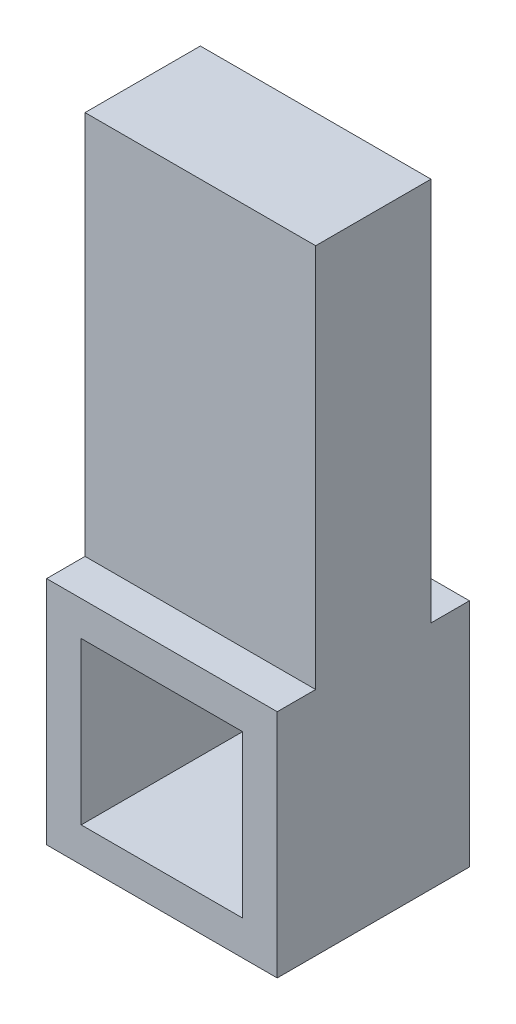
ISO-10303-21;
HEADER;
FILE_DESCRIPTION(('STEP AP214'),'2;1');
FILE_NAME('part.step','',(''),(''),'','','');
FILE_SCHEMA(('AUTOMOTIVE_DESIGN { 1 0 10303 214 1 1 1 1 }'));
ENDSEC;
DATA;
#1=APPLICATION_CONTEXT('core data for automotive mechanical design processes');
#2=APPLICATION_PROTOCOL_DEFINITION('international standard','automotive_design',2000,#1);
#3=PRODUCT_CONTEXT('',#1,'mechanical');
#4=PRODUCT('Part','Part','',(#3));
#5=PRODUCT_RELATED_PRODUCT_CATEGORY('part','',(#4));
#6=PRODUCT_DEFINITION_FORMATION('','',#4);
#7=PRODUCT_DEFINITION_CONTEXT('part definition',#1,'design');
#8=PRODUCT_DEFINITION('design','',#6,#7);
#9=PRODUCT_DEFINITION_SHAPE('','',#8);
#10=(LENGTH_UNIT() NAMED_UNIT(*) SI_UNIT(.MILLI.,.METRE.));
#11=(NAMED_UNIT(*) PLANE_ANGLE_UNIT() SI_UNIT($,.RADIAN.));
#12=(NAMED_UNIT(*) SI_UNIT($,.STERADIAN.) SOLID_ANGLE_UNIT());
#13=UNCERTAINTY_MEASURE_WITH_UNIT(LENGTH_MEASURE(1.E-05),#10,'distance_accuracy_value','');
#14=(GEOMETRIC_REPRESENTATION_CONTEXT(3) GLOBAL_UNCERTAINTY_ASSIGNED_CONTEXT((#13)) GLOBAL_UNIT_ASSIGNED_CONTEXT((#10,
#11,#12)) REPRESENTATION_CONTEXT('',''));
#15=CARTESIAN_POINT('',(0.,0.,0.));
#16=DIRECTION('',(0.,0.,1.));
#17=DIRECTION('',(1.,0.,0.));
#18=AXIS2_PLACEMENT_3D('',#15,#16,#17);
#19=CARTESIAN_POINT('',(3.,3.,2.5));
#20=DIRECTION('',(0.,-1.,0.));
#21=DIRECTION('',(1.,0.,0.));
#22=AXIS2_PLACEMENT_3D('',#19,#20,#21);
#23=PLANE('',#22);
#24=DIRECTION('',(1.,0.,0.));
#25=VECTOR('',#24,1.);
#26=CARTESIAN_POINT('',(-3.,3.,1.5));
#27=LINE('',#26,#25);
#28=CARTESIAN_POINT('',(-3.,3.,1.5));
#29=VERTEX_POINT('',#28);
#30=CARTESIAN_POINT('',(3.,3.,1.5));
#31=VERTEX_POINT('',#30);
#32=EDGE_CURVE('E142',#29,#31,#27,.T.);
#33=ORIENTED_EDGE('',*,*,#32,.F.);
#34=DIRECTION('',(0.,0.,-1.));
#35=VECTOR('',#34,1.);
#36=CARTESIAN_POINT('',(-3.,3.,2.5));
#37=LINE('',#36,#35);
#38=CARTESIAN_POINT('',(-3.,3.,2.5));
#39=VERTEX_POINT('',#38);
#40=EDGE_CURVE('E203',#39,#29,#37,.T.);
#41=ORIENTED_EDGE('',*,*,#40,.F.);
#42=DIRECTION('',(-1.,0.,0.));
#43=VECTOR('',#42,1.);
#44=CARTESIAN_POINT('',(3.,3.,2.5));
#45=LINE('',#44,#43);
#46=CARTESIAN_POINT('',(3.,3.,2.5));
#47=VERTEX_POINT('',#46);
#48=EDGE_CURVE('E194',#47,#39,#45,.T.);
#49=ORIENTED_EDGE('',*,*,#48,.F.);
#50=DIRECTION('',(0.,0.,-1.));
#51=VECTOR('',#50,1.);
#52=CARTESIAN_POINT('',(3.,3.,2.5));
#53=LINE('',#52,#51);
#54=EDGE_CURVE('E207',#47,#31,#53,.T.);
#55=ORIENTED_EDGE('',*,*,#54,.T.);
#56=EDGE_LOOP('',(#33,#41,#49,#55));
#57=FACE_BOUND('',#56,.T.);
#58=ADVANCED_FACE('F37',(#57),#23,.F.);
#59=CARTESIAN_POINT('',(0.,0.,2.5));
#60=DIRECTION('',(0.,0.,1.));
#61=DIRECTION('',(1.,0.,0.));
#62=AXIS2_PLACEMENT_3D('',#59,#60,#61);
#63=PLANE('',#62);
#64=DIRECTION('',(0.,-1.,0.));
#65=VECTOR('',#64,1.);
#66=CARTESIAN_POINT('',(-3.,-3.,2.5));
#67=LINE('',#66,#65);
#68=CARTESIAN_POINT('',(-3.,-3.,2.5));
#69=VERTEX_POINT('',#68);
#70=EDGE_CURVE('E186',#39,#69,#67,.T.);
#71=ORIENTED_EDGE('',*,*,#70,.T.);
#72=DIRECTION('',(1.,0.,0.));
#73=VECTOR('',#72,1.);
#74=CARTESIAN_POINT('',(3.,-3.,2.5));
#75=LINE('',#74,#73);
#76=CARTESIAN_POINT('',(3.,-3.,2.5));
#77=VERTEX_POINT('',#76);
#78=EDGE_CURVE('E189',#69,#77,#75,.T.);
#79=ORIENTED_EDGE('',*,*,#78,.T.);
#80=DIRECTION('',(0.,1.,0.));
#81=VECTOR('',#80,1.);
#82=CARTESIAN_POINT('',(3.,-3.,2.5));
#83=LINE('',#82,#81);
#84=EDGE_CURVE('E192',#77,#47,#83,.T.);
#85=ORIENTED_EDGE('',*,*,#84,.T.);
#86=ORIENTED_EDGE('',*,*,#48,.T.);
#87=EDGE_LOOP('',(#71,#79,#85,#86));
#88=FACE_BOUND('',#87,.T.);
#89=DIRECTION('',(1.,0.,0.));
#90=VECTOR('',#89,1.);
#91=CARTESIAN_POINT('',(2.1,-2.1,2.5));
#92=LINE('',#91,#90);
#93=CARTESIAN_POINT('',(-2.1,-2.1,2.5));
#94=VERTEX_POINT('',#93);
#95=CARTESIAN_POINT('',(2.1,-2.1,2.5));
#96=VERTEX_POINT('',#95);
#97=EDGE_CURVE('E160',#94,#96,#92,.T.);
#98=ORIENTED_EDGE('',*,*,#97,.F.);
#99=DIRECTION('',(0.,-1.,0.));
#100=VECTOR('',#99,1.);
#101=CARTESIAN_POINT('',(-2.1,-2.1,2.5));
#102=LINE('',#101,#100);
#103=CARTESIAN_POINT('',(-2.1,2.1,2.5));
#104=VERTEX_POINT('',#103);
#105=EDGE_CURVE('E158',#104,#94,#102,.T.);
#106=ORIENTED_EDGE('',*,*,#105,.F.);
#107=DIRECTION('',(-1.,0.,0.));
#108=VECTOR('',#107,1.);
#109=CARTESIAN_POINT('',(2.1,2.1,2.5));
#110=LINE('',#109,#108);
#111=CARTESIAN_POINT('',(2.1,2.1,2.5));
#112=VERTEX_POINT('',#111);
#113=EDGE_CURVE('E166',#112,#104,#110,.T.);
#114=ORIENTED_EDGE('',*,*,#113,.F.);
#115=DIRECTION('',(0.,1.,0.));
#116=VECTOR('',#115,1.);
#117=CARTESIAN_POINT('',(2.1,-2.1,2.5));
#118=LINE('',#117,#116);
#119=EDGE_CURVE('E163',#96,#112,#118,.T.);
#120=ORIENTED_EDGE('',*,*,#119,.F.);
#121=EDGE_LOOP('',(#98,#106,#114,#120));
#122=FACE_BOUND('',#121,.T.);
#123=ADVANCED_FACE('F236',(#88,#122),#63,.T.);
#124=CARTESIAN_POINT('',(0.,0.,-2.5));
#125=DIRECTION('',(0.,0.,1.));
#126=DIRECTION('',(1.,0.,0.));
#127=AXIS2_PLACEMENT_3D('',#124,#125,#126);
#128=PLANE('',#127);
#129=DIRECTION('',(0.,-1.,0.));
#130=VECTOR('',#129,1.);
#131=CARTESIAN_POINT('',(-3.,-3.,-2.5));
#132=LINE('',#131,#130);
#133=CARTESIAN_POINT('',(-3.,3.,-2.5));
#134=VERTEX_POINT('',#133);
#135=CARTESIAN_POINT('',(-3.,-3.,-2.5));
#136=VERTEX_POINT('',#135);
#137=EDGE_CURVE('E185',#134,#136,#132,.T.);
#138=ORIENTED_EDGE('',*,*,#137,.F.);
#139=DIRECTION('',(-1.,0.,0.));
#140=VECTOR('',#139,1.);
#141=CARTESIAN_POINT('',(3.,3.,-2.5));
#142=LINE('',#141,#140);
#143=CARTESIAN_POINT('',(3.,3.,-2.5));
#144=VERTEX_POINT('',#143);
#145=EDGE_CURVE('E190',#144,#134,#142,.T.);
#146=ORIENTED_EDGE('',*,*,#145,.F.);
#147=DIRECTION('',(0.,1.,0.));
#148=VECTOR('',#147,1.);
#149=CARTESIAN_POINT('',(3.,-3.,-2.5));
#150=LINE('',#149,#148);
#151=CARTESIAN_POINT('',(3.,-3.,-2.5));
#152=VERTEX_POINT('',#151);
#153=EDGE_CURVE('E200',#152,#144,#150,.T.);
#154=ORIENTED_EDGE('',*,*,#153,.F.);
#155=DIRECTION('',(1.,0.,0.));
#156=VECTOR('',#155,1.);
#157=CARTESIAN_POINT('',(3.,-3.,-2.5));
#158=LINE('',#157,#156);
#159=EDGE_CURVE('E198',#136,#152,#158,.T.);
#160=ORIENTED_EDGE('',*,*,#159,.F.);
#161=EDGE_LOOP('',(#138,#146,#154,#160));
#162=FACE_BOUND('',#161,.T.);
#163=DIRECTION('',(0.,-1.,0.));
#164=VECTOR('',#163,1.);
#165=CARTESIAN_POINT('',(-2.1,-2.1,-2.5));
#166=LINE('',#165,#164);
#167=CARTESIAN_POINT('',(-2.1,2.1,-2.5));
#168=VERTEX_POINT('',#167);
#169=CARTESIAN_POINT('',(-2.1,-2.1,-2.5));
#170=VERTEX_POINT('',#169);
#171=EDGE_CURVE('E150',#168,#170,#166,.T.);
#172=ORIENTED_EDGE('',*,*,#171,.T.);
#173=DIRECTION('',(1.,0.,0.));
#174=VECTOR('',#173,1.);
#175=CARTESIAN_POINT('',(2.1,-2.1,-2.5));
#176=LINE('',#175,#174);
#177=CARTESIAN_POINT('',(2.1,-2.1,-2.5));
#178=VERTEX_POINT('',#177);
#179=EDGE_CURVE('E153',#170,#178,#176,.T.);
#180=ORIENTED_EDGE('',*,*,#179,.T.);
#181=DIRECTION('',(0.,1.,0.));
#182=VECTOR('',#181,1.);
#183=CARTESIAN_POINT('',(2.1,-2.1,-2.5));
#184=LINE('',#183,#182);
#185=CARTESIAN_POINT('',(2.1,2.1,-2.5));
#186=VERTEX_POINT('',#185);
#187=EDGE_CURVE('E171',#178,#186,#184,.T.);
#188=ORIENTED_EDGE('',*,*,#187,.T.);
#189=DIRECTION('',(-1.,0.,0.));
#190=VECTOR('',#189,1.);
#191=CARTESIAN_POINT('',(2.1,2.1,-2.5));
#192=LINE('',#191,#190);
#193=EDGE_CURVE('E161',#186,#168,#192,.T.);
#194=ORIENTED_EDGE('',*,*,#193,.T.);
#195=EDGE_LOOP('',(#172,#180,#188,#194));
#196=FACE_BOUND('',#195,.T.);
#197=ADVANCED_FACE('F216',(#162,#196),#128,.F.);
#198=CARTESIAN_POINT('',(-3.,-3.,2.5));
#199=DIRECTION('',(1.,0.,0.));
#200=DIRECTION('',(0.,0.,-1.));
#201=AXIS2_PLACEMENT_3D('',#198,#199,#200);
#202=PLANE('',#201);
#203=ORIENTED_EDGE('',*,*,#137,.T.);
#204=DIRECTION('',(0.,0.,-1.));
#205=VECTOR('',#204,1.);
#206=CARTESIAN_POINT('',(-3.,-3.,2.5));
#207=LINE('',#206,#205);
#208=EDGE_CURVE('E11',#69,#136,#207,.T.);
#209=ORIENTED_EDGE('',*,*,#208,.F.);
#210=ORIENTED_EDGE('',*,*,#70,.F.);
#211=ORIENTED_EDGE('',*,*,#40,.T.);
#212=DIRECTION('',(0.,-1.,0.));
#213=VECTOR('',#212,1.);
#214=CARTESIAN_POINT('',(-3.,13.,1.5));
#215=LINE('',#214,#213);
#216=CARTESIAN_POINT('',(-3.,13.,1.5));
#217=VERTEX_POINT('',#216);
#218=EDGE_CURVE('E136',#217,#29,#215,.T.);
#219=ORIENTED_EDGE('',*,*,#218,.F.);
#220=DIRECTION('',(0.,0.,-1.));
#221=VECTOR('',#220,1.);
#222=CARTESIAN_POINT('',(-3.,13.,1.5));
#223=LINE('',#222,#221);
#224=CARTESIAN_POINT('',(-3.,13.,-1.5));
#225=VERTEX_POINT('',#224);
#226=EDGE_CURVE('E132',#217,#225,#223,.T.);
#227=ORIENTED_EDGE('',*,*,#226,.T.);
#228=DIRECTION('',(0.,-1.,0.));
#229=VECTOR('',#228,1.);
#230=CARTESIAN_POINT('',(-3.,13.,-1.5));
#231=LINE('',#230,#229);
#232=CARTESIAN_POINT('',(-3.,3.,-1.5));
#233=VERTEX_POINT('',#232);
#234=EDGE_CURVE('E224',#225,#233,#231,.T.);
#235=ORIENTED_EDGE('',*,*,#234,.T.);
#236=EDGE_CURVE('E57',#233,#134,#37,.T.);
#237=ORIENTED_EDGE('',*,*,#236,.T.);
#238=EDGE_LOOP('',(#203,#209,#210,#211,#219,#227,#235,#237));
#239=FACE_BOUND('',#238,.T.);
#240=ADVANCED_FACE('F39',(#239),#202,.F.);
#241=CARTESIAN_POINT('',(3.,-3.,2.5));
#242=DIRECTION('',(0.,1.,0.));
#243=DIRECTION('',(-1.,0.,0.));
#244=AXIS2_PLACEMENT_3D('',#241,#242,#243);
#245=PLANE('',#244);
#246=ORIENTED_EDGE('',*,*,#159,.T.);
#247=DIRECTION('',(0.,0.,-1.));
#248=VECTOR('',#247,1.);
#249=CARTESIAN_POINT('',(3.,-3.,2.5));
#250=LINE('',#249,#248);
#251=EDGE_CURVE('E45',#77,#152,#250,.T.);
#252=ORIENTED_EDGE('',*,*,#251,.F.);
#253=ORIENTED_EDGE('',*,*,#78,.F.);
#254=ORIENTED_EDGE('',*,*,#208,.T.);
#255=EDGE_LOOP('',(#246,#252,#253,#254));
#256=FACE_BOUND('',#255,.T.);
#257=ADVANCED_FACE('F238',(#256),#245,.F.);
#258=CARTESIAN_POINT('',(3.,-3.,2.5));
#259=DIRECTION('',(-1.,0.,0.));
#260=DIRECTION('',(0.,0.,1.));
#261=AXIS2_PLACEMENT_3D('',#258,#259,#260);
#262=PLANE('',#261);
#263=ORIENTED_EDGE('',*,*,#153,.T.);
#264=CARTESIAN_POINT('',(3.,3.,-1.5));
#265=VERTEX_POINT('',#264);
#266=EDGE_CURVE('E206',#265,#144,#53,.T.);
#267=ORIENTED_EDGE('',*,*,#266,.F.);
#268=DIRECTION('',(0.,1.,0.));
#269=VECTOR('',#268,1.);
#270=CARTESIAN_POINT('',(3.,3.,-1.5));
#271=LINE('',#270,#269);
#272=CARTESIAN_POINT('',(3.,13.,-1.5));
#273=VERTEX_POINT('',#272);
#274=EDGE_CURVE('E149',#265,#273,#271,.T.);
#275=ORIENTED_EDGE('',*,*,#274,.T.);
#276=DIRECTION('',(0.,0.,-1.));
#277=VECTOR('',#276,1.);
#278=CARTESIAN_POINT('',(3.,13.,1.5));
#279=LINE('',#278,#277);
#280=CARTESIAN_POINT('',(3.,13.,1.5));
#281=VERTEX_POINT('',#280);
#282=EDGE_CURVE('E129',#281,#273,#279,.T.);
#283=ORIENTED_EDGE('',*,*,#282,.F.);
#284=DIRECTION('',(0.,1.,0.));
#285=VECTOR('',#284,1.);
#286=CARTESIAN_POINT('',(3.,3.,1.5));
#287=LINE('',#286,#285);
#288=EDGE_CURVE('E137',#31,#281,#287,.T.);
#289=ORIENTED_EDGE('',*,*,#288,.F.);
#290=ORIENTED_EDGE('',*,*,#54,.F.);
#291=ORIENTED_EDGE('',*,*,#84,.F.);
#292=ORIENTED_EDGE('',*,*,#251,.T.);
#293=EDGE_LOOP('',(#263,#267,#275,#283,#289,#290,#291,#292));
#294=FACE_BOUND('',#293,.T.);
#295=ADVANCED_FACE('F147',(#294),#262,.F.);
#296=ORIENTED_EDGE('',*,*,#236,.F.);
#297=DIRECTION('',(1.,0.,0.));
#298=VECTOR('',#297,1.);
#299=CARTESIAN_POINT('',(-3.,3.,-1.5));
#300=LINE('',#299,#298);
#301=EDGE_CURVE('E52',#233,#265,#300,.T.);
#302=ORIENTED_EDGE('',*,*,#301,.T.);
#303=ORIENTED_EDGE('',*,*,#266,.T.);
#304=ORIENTED_EDGE('',*,*,#145,.T.);
#305=EDGE_LOOP('',(#296,#302,#303,#304));
#306=FACE_BOUND('',#305,.T.);
#307=ADVANCED_FACE('F218',(#306),#23,.F.);
#308=CARTESIAN_POINT('',(-2.1,-2.1,2.5));
#309=DIRECTION('',(1.,0.,0.));
#310=DIRECTION('',(0.,0.,-1.));
#311=AXIS2_PLACEMENT_3D('',#308,#309,#310);
#312=PLANE('',#311);
#313=ORIENTED_EDGE('',*,*,#171,.F.);
#314=DIRECTION('',(0.,0.,-1.));
#315=VECTOR('',#314,1.);
#316=CARTESIAN_POINT('',(-2.1,2.1,2.5));
#317=LINE('',#316,#315);
#318=EDGE_CURVE('E167',#104,#168,#317,.T.);
#319=ORIENTED_EDGE('',*,*,#318,.F.);
#320=ORIENTED_EDGE('',*,*,#105,.T.);
#321=DIRECTION('',(0.,0.,-1.));
#322=VECTOR('',#321,1.);
#323=CARTESIAN_POINT('',(-2.1,-2.1,2.5));
#324=LINE('',#323,#322);
#325=EDGE_CURVE('E182',#94,#170,#324,.T.);
#326=ORIENTED_EDGE('',*,*,#325,.T.);
#327=EDGE_LOOP('',(#313,#319,#320,#326));
#328=FACE_BOUND('',#327,.T.);
#329=ADVANCED_FACE('F253',(#328),#312,.T.);
#330=CARTESIAN_POINT('',(2.1,-2.1,2.5));
#331=DIRECTION('',(0.,1.,0.));
#332=DIRECTION('',(-1.,0.,0.));
#333=AXIS2_PLACEMENT_3D('',#330,#331,#332);
#334=PLANE('',#333);
#335=ORIENTED_EDGE('',*,*,#179,.F.);
#336=ORIENTED_EDGE('',*,*,#325,.F.);
#337=ORIENTED_EDGE('',*,*,#97,.T.);
#338=DIRECTION('',(0.,0.,-1.));
#339=VECTOR('',#338,1.);
#340=CARTESIAN_POINT('',(2.1,-2.1,2.5));
#341=LINE('',#340,#339);
#342=EDGE_CURVE('E180',#96,#178,#341,.T.);
#343=ORIENTED_EDGE('',*,*,#342,.T.);
#344=EDGE_LOOP('',(#335,#336,#337,#343));
#345=FACE_BOUND('',#344,.T.);
#346=ADVANCED_FACE('F257',(#345),#334,.T.);
#347=CARTESIAN_POINT('',(2.1,-2.1,2.5));
#348=DIRECTION('',(-1.,0.,0.));
#349=DIRECTION('',(0.,0.,1.));
#350=AXIS2_PLACEMENT_3D('',#347,#348,#349);
#351=PLANE('',#350);
#352=ORIENTED_EDGE('',*,*,#187,.F.);
#353=ORIENTED_EDGE('',*,*,#342,.F.);
#354=ORIENTED_EDGE('',*,*,#119,.T.);
#355=DIRECTION('',(0.,0.,-1.));
#356=VECTOR('',#355,1.);
#357=CARTESIAN_POINT('',(2.1,2.1,2.5));
#358=LINE('',#357,#356);
#359=EDGE_CURVE('E178',#112,#186,#358,.T.);
#360=ORIENTED_EDGE('',*,*,#359,.T.);
#361=EDGE_LOOP('',(#352,#353,#354,#360));
#362=FACE_BOUND('',#361,.T.);
#363=ADVANCED_FACE('F263',(#362),#351,.T.);
#364=CARTESIAN_POINT('',(2.1,2.1,2.5));
#365=DIRECTION('',(0.,-1.,0.));
#366=DIRECTION('',(0.,0.,-1.));
#367=AXIS2_PLACEMENT_3D('',#364,#365,#366);
#368=PLANE('',#367);
#369=ORIENTED_EDGE('',*,*,#193,.F.);
#370=ORIENTED_EDGE('',*,*,#359,.F.);
#371=ORIENTED_EDGE('',*,*,#113,.T.);
#372=ORIENTED_EDGE('',*,*,#318,.T.);
#373=EDGE_LOOP('',(#369,#370,#371,#372));
#374=FACE_BOUND('',#373,.T.);
#375=ADVANCED_FACE('F303',(#374),#368,.T.);
#376=CARTESIAN_POINT('',(3.,13.,1.5));
#377=DIRECTION('',(0.,-1.,0.));
#378=DIRECTION('',(0.,0.,-1.));
#379=AXIS2_PLACEMENT_3D('',#376,#377,#378);
#380=PLANE('',#379);
#381=DIRECTION('',(-1.,0.,0.));
#382=VECTOR('',#381,1.);
#383=CARTESIAN_POINT('',(3.,13.,-1.5));
#384=LINE('',#383,#382);
#385=EDGE_CURVE('E222',#273,#225,#384,.T.);
#386=ORIENTED_EDGE('',*,*,#385,.T.);
#387=ORIENTED_EDGE('',*,*,#226,.F.);
#388=DIRECTION('',(-1.,0.,0.));
#389=VECTOR('',#388,1.);
#390=CARTESIAN_POINT('',(3.,13.,1.5));
#391=LINE('',#390,#389);
#392=EDGE_CURVE('E125',#281,#217,#391,.T.);
#393=ORIENTED_EDGE('',*,*,#392,.F.);
#394=ORIENTED_EDGE('',*,*,#282,.T.);
#395=EDGE_LOOP('',(#386,#387,#393,#394));
#396=FACE_BOUND('',#395,.T.);
#397=ADVANCED_FACE('F127',(#396),#380,.F.);
#398=CARTESIAN_POINT('',(0.,0.,1.5));
#399=DIRECTION('',(0.,0.,1.));
#400=DIRECTION('',(1.,0.,0.));
#401=AXIS2_PLACEMENT_3D('',#398,#399,#400);
#402=PLANE('',#401);
#403=ORIENTED_EDGE('',*,*,#288,.T.);
#404=ORIENTED_EDGE('',*,*,#392,.T.);
#405=ORIENTED_EDGE('',*,*,#218,.T.);
#406=ORIENTED_EDGE('',*,*,#32,.T.);
#407=EDGE_LOOP('',(#403,#404,#405,#406));
#408=FACE_BOUND('',#407,.T.);
#409=ADVANCED_FACE('F141',(#408),#402,.T.);
#410=CARTESIAN_POINT('',(0.,0.,-1.5));
#411=DIRECTION('',(0.,0.,1.));
#412=DIRECTION('',(1.,0.,0.));
#413=AXIS2_PLACEMENT_3D('',#410,#411,#412);
#414=PLANE('',#413);
#415=ORIENTED_EDGE('',*,*,#274,.F.);
#416=ORIENTED_EDGE('',*,*,#301,.F.);
#417=ORIENTED_EDGE('',*,*,#234,.F.);
#418=ORIENTED_EDGE('',*,*,#385,.F.);
#419=EDGE_LOOP('',(#415,#416,#417,#418));
#420=FACE_BOUND('',#419,.T.);
#421=ADVANCED_FACE('F220',(#420),#414,.F.);
#422=CLOSED_SHELL('',(#58,#123,#197,#240,#257,#295,#307,#329,#346,#363,#375,#397,#409,#421));
#423=MANIFOLD_SOLID_BREP('B2',#422);
#424=ADVANCED_BREP_SHAPE_REPRESENTATION('',(#18,#423),#14);
#425=SHAPE_DEFINITION_REPRESENTATION(#9,#424);
ENDSEC;
END-ISO-10303-21;
